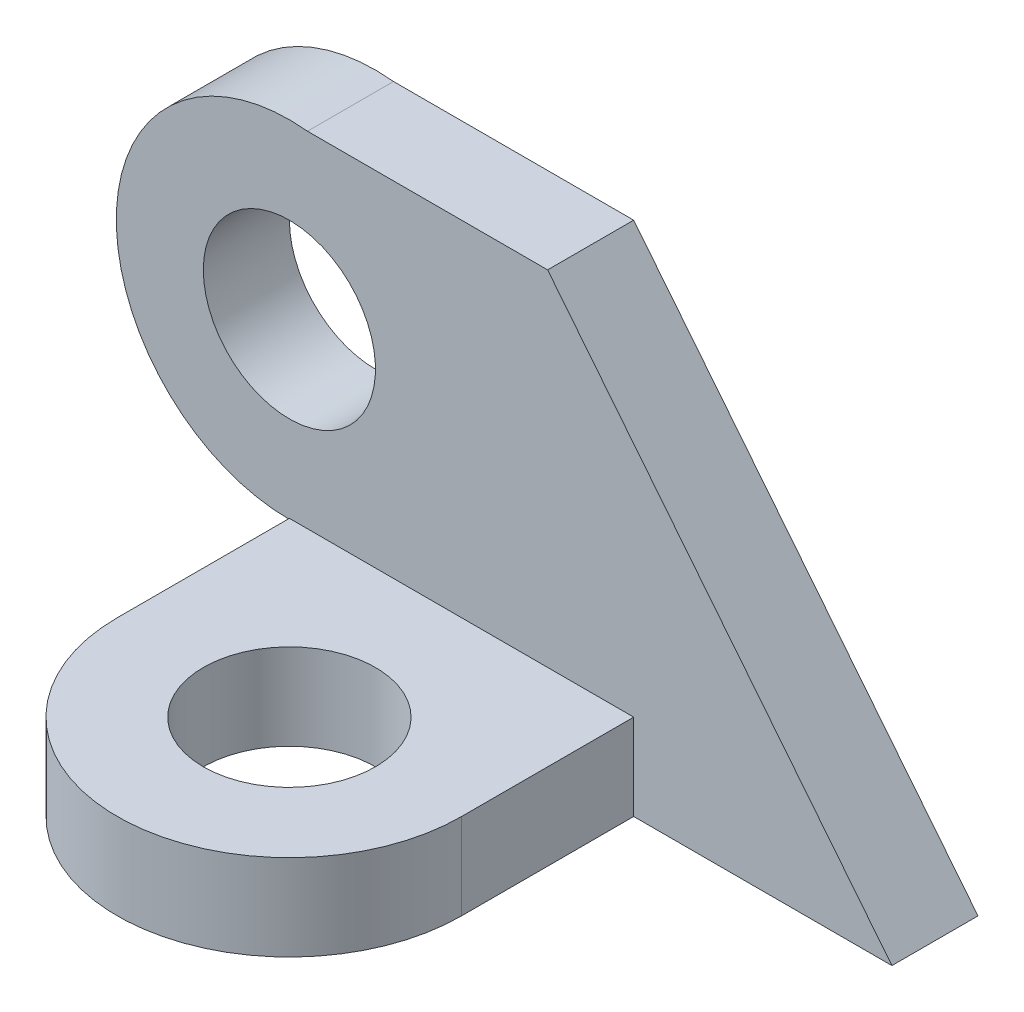
ISO-10303-21;
HEADER;
FILE_DESCRIPTION(('STEP AP214'),'2;1');
FILE_NAME('part.step','',(''),(''),'','','');
FILE_SCHEMA(('AUTOMOTIVE_DESIGN { 1 0 10303 214 1 1 1 1 }'));
ENDSEC;
DATA;
#1=APPLICATION_CONTEXT('core data for automotive mechanical design processes');
#2=APPLICATION_PROTOCOL_DEFINITION('international standard','automotive_design',2000,#1);
#3=PRODUCT_CONTEXT('',#1,'mechanical');
#4=PRODUCT('Part','Part','',(#3));
#5=PRODUCT_RELATED_PRODUCT_CATEGORY('part','',(#4));
#6=PRODUCT_DEFINITION_FORMATION('','',#4);
#7=PRODUCT_DEFINITION_CONTEXT('part definition',#1,'design');
#8=PRODUCT_DEFINITION('design','',#6,#7);
#9=PRODUCT_DEFINITION_SHAPE('','',#8);
#10=(LENGTH_UNIT() NAMED_UNIT(*) SI_UNIT(.MILLI.,.METRE.));
#11=(NAMED_UNIT(*) PLANE_ANGLE_UNIT() SI_UNIT($,.RADIAN.));
#12=(NAMED_UNIT(*) SI_UNIT($,.STERADIAN.) SOLID_ANGLE_UNIT());
#13=UNCERTAINTY_MEASURE_WITH_UNIT(LENGTH_MEASURE(1.E-05),#10,'distance_accuracy_value','');
#14=(GEOMETRIC_REPRESENTATION_CONTEXT(3) GLOBAL_UNCERTAINTY_ASSIGNED_CONTEXT((#13)) GLOBAL_UNIT_ASSIGNED_CONTEXT((#10,
#11,#12)) REPRESENTATION_CONTEXT('',''));
#15=CARTESIAN_POINT('',(0.,0.,0.));
#16=DIRECTION('',(0.,0.,1.));
#17=DIRECTION('',(1.,0.,0.));
#18=AXIS2_PLACEMENT_3D('',#15,#16,#17);
#19=CARTESIAN_POINT('',(-20.,30.,-30.));
#20=DIRECTION('',(0.,0.,1.));
#21=DIRECTION('',(1.,0.,0.));
#22=AXIS2_PLACEMENT_3D('',#19,#20,#21);
#23=CYLINDRICAL_SURFACE('',#22,20.1098289675562);
#24=CARTESIAN_POINT('',(-20.,30.,-20.));
#25=DIRECTION('',(0.,0.,-1.));
#26=DIRECTION('',(-1.,0.,0.));
#27=AXIS2_PLACEMENT_3D('',#24,#25,#26);
#28=CIRCLE('',#27,20.1098289675562);
#29=CARTESIAN_POINT('',(-20.,9.8901710324438,-20.));
#30=VERTEX_POINT('',#29);
#31=CARTESIAN_POINT('',(-17.9011381407148,50.,-20.));
#32=VERTEX_POINT('',#31);
#33=EDGE_CURVE('E149',#30,#32,#28,.T.);
#34=ORIENTED_EDGE('',*,*,#33,.T.);
#35=DIRECTION('',(0.,0.,1.));
#36=VECTOR('',#35,1.);
#37=CARTESIAN_POINT('',(-17.9011381407148,50.,-30.));
#38=LINE('',#37,#36);
#39=CARTESIAN_POINT('',(-17.9011381407148,50.,-30.));
#40=VERTEX_POINT('',#39);
#41=EDGE_CURVE('E12',#40,#32,#38,.T.);
#42=ORIENTED_EDGE('',*,*,#41,.F.);
#43=CARTESIAN_POINT('',(-20.,30.,-30.));
#44=DIRECTION('',(0.,0.,-1.));
#45=DIRECTION('',(-1.,0.,0.));
#46=AXIS2_PLACEMENT_3D('',#43,#44,#45);
#47=CIRCLE('',#46,20.1098289675562);
#48=CARTESIAN_POINT('',(-20.,9.8901710324438,-30.));
#49=VERTEX_POINT('',#48);
#50=EDGE_CURVE('E200',#49,#40,#47,.T.);
#51=ORIENTED_EDGE('',*,*,#50,.F.);
#52=DIRECTION('',(0.,0.,1.));
#53=VECTOR('',#52,1.);
#54=CARTESIAN_POINT('',(-20.,9.8901710324438,-30.));
#55=LINE('',#54,#53);
#56=EDGE_CURVE('E67',#49,#30,#55,.T.);
#57=ORIENTED_EDGE('',*,*,#56,.T.);
#58=EDGE_LOOP('',(#34,#42,#51,#57));
#59=FACE_BOUND('',#58,.T.);
#60=ADVANCED_FACE('F49',(#59),#23,.T.);
#61=CARTESIAN_POINT('',(0.,50.,-30.));
#62=DIRECTION('',(0.,-1.,0.));
#63=DIRECTION('',(1.,0.,0.));
#64=AXIS2_PLACEMENT_3D('',#61,#62,#63);
#65=PLANE('',#64);
#66=DIRECTION('',(1.,0.,0.));
#67=VECTOR('',#66,1.);
#68=CARTESIAN_POINT('',(0.,50.,-20.));
#69=LINE('',#68,#67);
#70=CARTESIAN_POINT('',(10.,50.,-20.));
#71=VERTEX_POINT('',#70);
#72=EDGE_CURVE('E152',#32,#71,#69,.T.);
#73=ORIENTED_EDGE('',*,*,#72,.T.);
#74=DIRECTION('',(0.,0.,1.));
#75=VECTOR('',#74,1.);
#76=CARTESIAN_POINT('',(10.,50.,-30.));
#77=LINE('',#76,#75);
#78=CARTESIAN_POINT('',(10.,50.,-30.));
#79=VERTEX_POINT('',#78);
#80=EDGE_CURVE('E59',#79,#71,#77,.T.);
#81=ORIENTED_EDGE('',*,*,#80,.F.);
#82=DIRECTION('',(1.,0.,0.));
#83=VECTOR('',#82,1.);
#84=CARTESIAN_POINT('',(0.,50.,-30.));
#85=LINE('',#84,#83);
#86=EDGE_CURVE('E102',#40,#79,#85,.T.);
#87=ORIENTED_EDGE('',*,*,#86,.F.);
#88=ORIENTED_EDGE('',*,*,#41,.T.);
#89=EDGE_LOOP('',(#73,#81,#87,#88));
#90=FACE_BOUND('',#89,.T.);
#91=ADVANCED_FACE('F220',(#90),#65,.F.);
#92=CARTESIAN_POINT('',(30.4878048780488,24.390243902439,-30.));
#93=DIRECTION('',(-0.78086880944303,-0.624695047554424,0.));
#94=DIRECTION('',(0.624695047554424,-0.78086880944303,0.));
#95=AXIS2_PLACEMENT_3D('',#92,#93,#94);
#96=PLANE('',#95);
#97=DIRECTION('',(0.624695047554424,-0.78086880944303,0.));
#98=VECTOR('',#97,1.);
#99=CARTESIAN_POINT('',(30.4878048780488,24.390243902439,-20.));
#100=LINE('',#99,#98);
#101=CARTESIAN_POINT('',(50.,0.,-20.));
#102=VERTEX_POINT('',#101);
#103=EDGE_CURVE('E155',#71,#102,#100,.T.);
#104=ORIENTED_EDGE('',*,*,#103,.T.);
#105=DIRECTION('',(0.,0.,1.));
#106=VECTOR('',#105,1.);
#107=CARTESIAN_POINT('',(50.,0.,-30.));
#108=LINE('',#107,#106);
#109=CARTESIAN_POINT('',(50.,0.,-30.));
#110=VERTEX_POINT('',#109);
#111=EDGE_CURVE('E179',#110,#102,#108,.T.);
#112=ORIENTED_EDGE('',*,*,#111,.F.);
#113=DIRECTION('',(0.624695047554424,-0.78086880944303,0.));
#114=VECTOR('',#113,1.);
#115=CARTESIAN_POINT('',(30.4878048780488,24.390243902439,-30.));
#116=LINE('',#115,#114);
#117=EDGE_CURVE('E188',#79,#110,#116,.T.);
#118=ORIENTED_EDGE('',*,*,#117,.F.);
#119=ORIENTED_EDGE('',*,*,#80,.T.);
#120=EDGE_LOOP('',(#104,#112,#118,#119));
#121=FACE_BOUND('',#120,.T.);
#122=ADVANCED_FACE('F186',(#121),#96,.F.);
#123=CARTESIAN_POINT('',(0.,0.,-30.));
#124=DIRECTION('',(0.,-1.,0.));
#125=DIRECTION('',(1.,0.,0.));
#126=AXIS2_PLACEMENT_3D('',#123,#124,#125);
#127=PLANE('',#126);
#128=DIRECTION('',(1.,0.,0.));
#129=VECTOR('',#128,1.);
#130=CARTESIAN_POINT('',(0.,0.,-20.));
#131=LINE('',#130,#129);
#132=CARTESIAN_POINT('',(20.,0.,-20.));
#133=VERTEX_POINT('',#132);
#134=EDGE_CURVE('E159',#133,#102,#131,.T.);
#135=ORIENTED_EDGE('',*,*,#134,.F.);
#136=DIRECTION('',(0.,0.,1.));
#137=VECTOR('',#136,1.);
#138=CARTESIAN_POINT('',(20.,0.,-30.));
#139=LINE('',#138,#137);
#140=CARTESIAN_POINT('',(20.,0.,-30.));
#141=VERTEX_POINT('',#140);
#142=EDGE_CURVE('E125',#141,#133,#139,.T.);
#143=ORIENTED_EDGE('',*,*,#142,.F.);
#144=DIRECTION('',(1.,0.,0.));
#145=VECTOR('',#144,1.);
#146=CARTESIAN_POINT('',(0.,0.,-30.));
#147=LINE('',#146,#145);
#148=EDGE_CURVE('E134',#141,#110,#147,.T.);
#149=ORIENTED_EDGE('',*,*,#148,.T.);
#150=ORIENTED_EDGE('',*,*,#111,.T.);
#151=EDGE_LOOP('',(#135,#143,#149,#150));
#152=FACE_BOUND('',#151,.T.);
#153=ADVANCED_FACE('F193',(#152),#127,.T.);
#154=CARTESIAN_POINT('',(20.,0.,-30.));
#155=DIRECTION('',(-1.,0.,0.));
#156=DIRECTION('',(0.,0.,1.));
#157=AXIS2_PLACEMENT_3D('',#154,#155,#156);
#158=PLANE('',#157);
#159=DIRECTION('',(0.,-1.,0.));
#160=VECTOR('',#159,1.);
#161=CARTESIAN_POINT('',(20.,0.,-20.));
#162=LINE('',#161,#160);
#163=CARTESIAN_POINT('',(20.,10.,-20.));
#164=VERTEX_POINT('',#163);
#165=EDGE_CURVE('E120',#164,#133,#162,.T.);
#166=ORIENTED_EDGE('',*,*,#165,.F.);
#167=DIRECTION('',(0.,0.,1.));
#168=VECTOR('',#167,1.);
#169=CARTESIAN_POINT('',(20.,10.,-30.));
#170=LINE('',#169,#168);
#171=CARTESIAN_POINT('',(20.,10.,-30.));
#172=VERTEX_POINT('',#171);
#173=EDGE_CURVE('E115',#172,#164,#170,.T.);
#174=ORIENTED_EDGE('',*,*,#173,.F.);
#175=DIRECTION('',(0.,-1.,0.));
#176=VECTOR('',#175,1.);
#177=CARTESIAN_POINT('',(20.,0.,-30.));
#178=LINE('',#177,#176);
#179=EDGE_CURVE('E118',#172,#141,#178,.T.);
#180=ORIENTED_EDGE('',*,*,#179,.T.);
#181=ORIENTED_EDGE('',*,*,#142,.T.);
#182=EDGE_LOOP('',(#166,#174,#180,#181));
#183=FACE_BOUND('',#182,.T.);
#184=ADVANCED_FACE('F117',(#183),#158,.T.);
#185=CARTESIAN_POINT('',(0.,10.,-30.));
#186=DIRECTION('',(0.,-1.,0.));
#187=DIRECTION('',(0.,0.,-1.));
#188=AXIS2_PLACEMENT_3D('',#185,#186,#187);
#189=PLANE('',#188);
#190=DIRECTION('',(1.,0.,0.));
#191=VECTOR('',#190,1.);
#192=CARTESIAN_POINT('',(0.,10.,-20.));
#193=LINE('',#192,#191);
#194=CARTESIAN_POINT('',(-20.,10.,-20.));
#195=VERTEX_POINT('',#194);
#196=EDGE_CURVE('E165',#195,#164,#193,.T.);
#197=ORIENTED_EDGE('',*,*,#196,.F.);
#198=DIRECTION('',(0.,0.,1.));
#199=VECTOR('',#198,1.);
#200=CARTESIAN_POINT('',(-20.,10.,-30.));
#201=LINE('',#200,#199);
#202=CARTESIAN_POINT('',(-20.,10.,-30.));
#203=VERTEX_POINT('',#202);
#204=EDGE_CURVE('E90',#203,#195,#201,.T.);
#205=ORIENTED_EDGE('',*,*,#204,.F.);
#206=DIRECTION('',(1.,0.,0.));
#207=VECTOR('',#206,1.);
#208=CARTESIAN_POINT('',(0.,10.,-30.));
#209=LINE('',#208,#207);
#210=EDGE_CURVE('E132',#203,#172,#209,.T.);
#211=ORIENTED_EDGE('',*,*,#210,.T.);
#212=ORIENTED_EDGE('',*,*,#173,.T.);
#213=EDGE_LOOP('',(#197,#205,#211,#212));
#214=FACE_BOUND('',#213,.T.);
#215=ADVANCED_FACE('F137',(#214),#189,.T.);
#216=CARTESIAN_POINT('',(-20.,30.,-30.));
#217=DIRECTION('',(0.,0.,1.));
#218=DIRECTION('',(1.,0.,0.));
#219=AXIS2_PLACEMENT_3D('',#216,#217,#218);
#220=CYLINDRICAL_SURFACE('',#219,10.);
#221=CARTESIAN_POINT('',(-20.,30.,-30.));
#222=DIRECTION('',(0.,0.,-1.));
#223=DIRECTION('',(-1.,0.,0.));
#224=AXIS2_PLACEMENT_3D('',#221,#222,#223);
#225=CIRCLE('',#224,10.);
#226=CARTESIAN_POINT('',(-30.,30.,-30.));
#227=VERTEX_POINT('',#226);
#228=EDGE_CURVE('E172',#227,#227,#225,.T.);
#229=ORIENTED_EDGE('',*,*,#228,.T.);
#230=EDGE_LOOP('',(#229));
#231=FACE_BOUND('',#230,.T.);
#232=CARTESIAN_POINT('',(-20.,30.,-20.));
#233=DIRECTION('',(0.,0.,-1.));
#234=DIRECTION('',(-1.,0.,0.));
#235=AXIS2_PLACEMENT_3D('',#232,#233,#234);
#236=CIRCLE('',#235,10.);
#237=CARTESIAN_POINT('',(-30.,30.,-20.));
#238=VERTEX_POINT('',#237);
#239=EDGE_CURVE('E145',#238,#238,#236,.T.);
#240=ORIENTED_EDGE('',*,*,#239,.F.);
#241=EDGE_LOOP('',(#240));
#242=FACE_BOUND('',#241,.T.);
#243=ADVANCED_FACE('F51',(#231,#242),#220,.F.);
#244=CARTESIAN_POINT('',(-20.,0.,-30.));
#245=DIRECTION('',(1.,0.,0.));
#246=DIRECTION('',(0.,0.,-1.));
#247=AXIS2_PLACEMENT_3D('',#244,#245,#246);
#248=PLANE('',#247);
#249=DIRECTION('',(0.,1.,0.));
#250=VECTOR('',#249,1.);
#251=CARTESIAN_POINT('',(-20.,0.,-20.));
#252=LINE('',#251,#250);
#253=EDGE_CURVE('E168',#30,#195,#252,.T.);
#254=ORIENTED_EDGE('',*,*,#253,.F.);
#255=ORIENTED_EDGE('',*,*,#56,.F.);
#256=DIRECTION('',(0.,1.,0.));
#257=VECTOR('',#256,1.);
#258=CARTESIAN_POINT('',(-20.,0.,-30.));
#259=LINE('',#258,#257);
#260=EDGE_CURVE('E139',#49,#203,#259,.T.);
#261=ORIENTED_EDGE('',*,*,#260,.T.);
#262=ORIENTED_EDGE('',*,*,#204,.T.);
#263=EDGE_LOOP('',(#254,#255,#261,#262));
#264=FACE_BOUND('',#263,.T.);
#265=ADVANCED_FACE('F210',(#264),#248,.T.);
#266=CARTESIAN_POINT('',(0.,0.,-30.));
#267=DIRECTION('',(0.,0.,-1.));
#268=DIRECTION('',(-1.,0.,0.));
#269=AXIS2_PLACEMENT_3D('',#266,#267,#268);
#270=PLANE('',#269);
#271=ORIENTED_EDGE('',*,*,#228,.F.);
#272=EDGE_LOOP('',(#271));
#273=FACE_BOUND('',#272,.T.);
#274=ORIENTED_EDGE('',*,*,#50,.T.);
#275=ORIENTED_EDGE('',*,*,#86,.T.);
#276=ORIENTED_EDGE('',*,*,#117,.T.);
#277=ORIENTED_EDGE('',*,*,#148,.F.);
#278=ORIENTED_EDGE('',*,*,#179,.F.);
#279=ORIENTED_EDGE('',*,*,#210,.F.);
#280=ORIENTED_EDGE('',*,*,#260,.F.);
#281=EDGE_LOOP('',(#274,#275,#276,#277,#278,#279,#280));
#282=FACE_BOUND('',#281,.T.);
#283=ADVANCED_FACE('F130',(#273,#282),#270,.T.);
#284=CARTESIAN_POINT('',(0.,0.,-20.));
#285=DIRECTION('',(0.,0.,-1.));
#286=DIRECTION('',(-1.,0.,0.));
#287=AXIS2_PLACEMENT_3D('',#284,#285,#286);
#288=PLANE('',#287);
#289=ORIENTED_EDGE('',*,*,#239,.T.);
#290=EDGE_LOOP('',(#289));
#291=FACE_BOUND('',#290,.T.);
#292=ORIENTED_EDGE('',*,*,#33,.F.);
#293=ORIENTED_EDGE('',*,*,#253,.T.);
#294=ORIENTED_EDGE('',*,*,#196,.T.);
#295=ORIENTED_EDGE('',*,*,#165,.T.);
#296=ORIENTED_EDGE('',*,*,#134,.T.);
#297=ORIENTED_EDGE('',*,*,#103,.F.);
#298=ORIENTED_EDGE('',*,*,#72,.F.);
#299=EDGE_LOOP('',(#292,#293,#294,#295,#296,#297,#298));
#300=FACE_BOUND('',#299,.T.);
#301=ADVANCED_FACE('F190',(#291,#300),#288,.F.);
#302=CLOSED_SHELL('',(#60,#91,#122,#153,#184,#215,#243,#265,#283,#301));
#303=MANIFOLD_SOLID_BREP('B2',#302);
#304=CARTESIAN_POINT('',(0.,10.,0.));
#305=DIRECTION('',(0.,1.,0.));
#306=DIRECTION('',(0.,0.,1.));
#307=AXIS2_PLACEMENT_3D('',#304,#305,#306);
#308=PLANE('',#307);
#309=CARTESIAN_POINT('',(0.,10.,0.));
#310=DIRECTION('',(0.,1.,0.));
#311=DIRECTION('',(0.,0.,1.));
#312=AXIS2_PLACEMENT_3D('',#309,#310,#311);
#313=CIRCLE('',#312,20.);
#314=CARTESIAN_POINT('',(-20.,10.,0.));
#315=VERTEX_POINT('',#314);
#316=CARTESIAN_POINT('',(20.,10.,0.));
#317=VERTEX_POINT('',#316);
#318=EDGE_CURVE('E356',#315,#317,#313,.T.);
#319=ORIENTED_EDGE('',*,*,#318,.T.);
#320=DIRECTION('',(0.,0.,-1.));
#321=VECTOR('',#320,1.);
#322=CARTESIAN_POINT('',(20.,10.,-20.));
#323=LINE('',#322,#321);
#324=CARTESIAN_POINT('',(20.,10.,-20.));
#325=VERTEX_POINT('',#324);
#326=EDGE_CURVE('E351',#317,#325,#323,.T.);
#327=ORIENTED_EDGE('',*,*,#326,.T.);
#328=DIRECTION('',(-1.,0.,0.));
#329=VECTOR('',#328,1.);
#330=CARTESIAN_POINT('',(-20.,10.,-20.));
#331=LINE('',#330,#329);
#332=CARTESIAN_POINT('',(-20.,10.,-20.));
#333=VERTEX_POINT('',#332);
#334=EDGE_CURVE('E354',#325,#333,#331,.T.);
#335=ORIENTED_EDGE('',*,*,#334,.T.);
#336=DIRECTION('',(0.,0.,1.));
#337=VECTOR('',#336,1.);
#338=CARTESIAN_POINT('',(-20.,10.,0.));
#339=LINE('',#338,#337);
#340=EDGE_CURVE('E324',#333,#315,#339,.T.);
#341=ORIENTED_EDGE('',*,*,#340,.T.);
#342=EDGE_LOOP('',(#319,#327,#335,#341));
#343=FACE_BOUND('',#342,.T.);
#344=CARTESIAN_POINT('',(0.,10.,0.));
#345=DIRECTION('',(0.,1.,0.));
#346=DIRECTION('',(0.,0.,1.));
#347=AXIS2_PLACEMENT_3D('',#344,#345,#346);
#348=CIRCLE('',#347,10.);
#349=CARTESIAN_POINT('',(0.,10.,10.));
#350=VERTEX_POINT('',#349);
#351=EDGE_CURVE('E373',#350,#350,#348,.T.);
#352=ORIENTED_EDGE('',*,*,#351,.F.);
#353=EDGE_LOOP('',(#352));
#354=FACE_BOUND('',#353,.T.);
#355=ADVANCED_FACE('F307',(#343,#354),#308,.T.);
#356=CARTESIAN_POINT('',(0.,0.,0.));
#357=DIRECTION('',(0.,1.,0.));
#358=DIRECTION('',(0.,0.,1.));
#359=AXIS2_PLACEMENT_3D('',#356,#357,#358);
#360=PLANE('',#359);
#361=CARTESIAN_POINT('',(0.,0.,0.));
#362=DIRECTION('',(0.,1.,0.));
#363=DIRECTION('',(0.,0.,1.));
#364=AXIS2_PLACEMENT_3D('',#361,#362,#363);
#365=CIRCLE('',#364,20.);
#366=CARTESIAN_POINT('',(-20.,0.,0.));
#367=VERTEX_POINT('',#366);
#368=CARTESIAN_POINT('',(20.,0.,0.));
#369=VERTEX_POINT('',#368);
#370=EDGE_CURVE('E370',#367,#369,#365,.T.);
#371=ORIENTED_EDGE('',*,*,#370,.F.);
#372=DIRECTION('',(0.,0.,1.));
#373=VECTOR('',#372,1.);
#374=CARTESIAN_POINT('',(-20.,0.,0.));
#375=LINE('',#374,#373);
#376=CARTESIAN_POINT('',(-20.,0.,-20.));
#377=VERTEX_POINT('',#376);
#378=EDGE_CURVE('E344',#377,#367,#375,.T.);
#379=ORIENTED_EDGE('',*,*,#378,.F.);
#380=DIRECTION('',(-1.,0.,0.));
#381=VECTOR('',#380,1.);
#382=CARTESIAN_POINT('',(-20.,0.,-20.));
#383=LINE('',#382,#381);
#384=CARTESIAN_POINT('',(20.,0.,-20.));
#385=VERTEX_POINT('',#384);
#386=EDGE_CURVE('E375',#385,#377,#383,.T.);
#387=ORIENTED_EDGE('',*,*,#386,.F.);
#388=DIRECTION('',(0.,0.,-1.));
#389=VECTOR('',#388,1.);
#390=CARTESIAN_POINT('',(20.,0.,-20.));
#391=LINE('',#390,#389);
#392=EDGE_CURVE('E361',#369,#385,#391,.T.);
#393=ORIENTED_EDGE('',*,*,#392,.F.);
#394=EDGE_LOOP('',(#371,#379,#387,#393));
#395=FACE_BOUND('',#394,.T.);
#396=CARTESIAN_POINT('',(0.,0.,0.));
#397=DIRECTION('',(0.,1.,0.));
#398=DIRECTION('',(0.,0.,1.));
#399=AXIS2_PLACEMENT_3D('',#396,#397,#398);
#400=CIRCLE('',#399,10.);
#401=CARTESIAN_POINT('',(0.,0.,10.));
#402=VERTEX_POINT('',#401);
#403=EDGE_CURVE('E388',#402,#402,#400,.T.);
#404=ORIENTED_EDGE('',*,*,#403,.T.);
#405=EDGE_LOOP('',(#404));
#406=FACE_BOUND('',#405,.T.);
#407=ADVANCED_FACE('F382',(#395,#406),#360,.F.);
#408=CARTESIAN_POINT('',(0.,10.,0.));
#409=DIRECTION('',(0.,-1.,0.));
#410=DIRECTION('',(0.,0.,-1.));
#411=AXIS2_PLACEMENT_3D('',#408,#409,#410);
#412=CYLINDRICAL_SURFACE('',#411,20.);
#413=ORIENTED_EDGE('',*,*,#370,.T.);
#414=DIRECTION('',(0.,-1.,0.));
#415=VECTOR('',#414,1.);
#416=CARTESIAN_POINT('',(20.,10.,0.));
#417=LINE('',#416,#415);
#418=EDGE_CURVE('E47',#317,#369,#417,.T.);
#419=ORIENTED_EDGE('',*,*,#418,.F.);
#420=ORIENTED_EDGE('',*,*,#318,.F.);
#421=DIRECTION('',(0.,-1.,0.));
#422=VECTOR('',#421,1.);
#423=CARTESIAN_POINT('',(-20.,10.,0.));
#424=LINE('',#423,#422);
#425=EDGE_CURVE('E366',#315,#367,#424,.T.);
#426=ORIENTED_EDGE('',*,*,#425,.T.);
#427=EDGE_LOOP('',(#413,#419,#420,#426));
#428=FACE_BOUND('',#427,.T.);
#429=ADVANCED_FACE('F309',(#428),#412,.T.);
#430=CARTESIAN_POINT('',(20.,10.,-20.));
#431=DIRECTION('',(-1.,0.,0.));
#432=DIRECTION('',(0.,0.,1.));
#433=AXIS2_PLACEMENT_3D('',#430,#431,#432);
#434=PLANE('',#433);
#435=ORIENTED_EDGE('',*,*,#392,.T.);
#436=DIRECTION('',(0.,-1.,0.));
#437=VECTOR('',#436,1.);
#438=CARTESIAN_POINT('',(20.,10.,-20.));
#439=LINE('',#438,#437);
#440=EDGE_CURVE('E316',#325,#385,#439,.T.);
#441=ORIENTED_EDGE('',*,*,#440,.F.);
#442=ORIENTED_EDGE('',*,*,#326,.F.);
#443=ORIENTED_EDGE('',*,*,#418,.T.);
#444=EDGE_LOOP('',(#435,#441,#442,#443));
#445=FACE_BOUND('',#444,.T.);
#446=ADVANCED_FACE('F360',(#445),#434,.F.);
#447=CARTESIAN_POINT('',(-20.,10.,-20.));
#448=DIRECTION('',(0.,0.,1.));
#449=DIRECTION('',(1.,0.,0.));
#450=AXIS2_PLACEMENT_3D('',#447,#448,#449);
#451=PLANE('',#450);
#452=ORIENTED_EDGE('',*,*,#386,.T.);
#453=DIRECTION('',(0.,-1.,0.));
#454=VECTOR('',#453,1.);
#455=CARTESIAN_POINT('',(-20.,10.,-20.));
#456=LINE('',#455,#454);
#457=EDGE_CURVE('E340',#333,#377,#456,.T.);
#458=ORIENTED_EDGE('',*,*,#457,.F.);
#459=ORIENTED_EDGE('',*,*,#334,.F.);
#460=ORIENTED_EDGE('',*,*,#440,.T.);
#461=EDGE_LOOP('',(#452,#458,#459,#460));
#462=FACE_BOUND('',#461,.T.);
#463=ADVANCED_FACE('F364',(#462),#451,.F.);
#464=CARTESIAN_POINT('',(-20.,10.,0.));
#465=DIRECTION('',(1.,0.,0.));
#466=DIRECTION('',(0.,0.,-1.));
#467=AXIS2_PLACEMENT_3D('',#464,#465,#466);
#468=PLANE('',#467);
#469=ORIENTED_EDGE('',*,*,#378,.T.);
#470=ORIENTED_EDGE('',*,*,#425,.F.);
#471=ORIENTED_EDGE('',*,*,#340,.F.);
#472=ORIENTED_EDGE('',*,*,#457,.T.);
#473=EDGE_LOOP('',(#469,#470,#471,#472));
#474=FACE_BOUND('',#473,.T.);
#475=ADVANCED_FACE('F402',(#474),#468,.F.);
#476=CARTESIAN_POINT('',(0.,10.,0.));
#477=DIRECTION('',(0.,-1.,0.));
#478=DIRECTION('',(0.,0.,-1.));
#479=AXIS2_PLACEMENT_3D('',#476,#477,#478);
#480=CYLINDRICAL_SURFACE('',#479,10.);
#481=ORIENTED_EDGE('',*,*,#351,.T.);
#482=EDGE_LOOP('',(#481));
#483=FACE_BOUND('',#482,.T.);
#484=ORIENTED_EDGE('',*,*,#403,.F.);
#485=EDGE_LOOP('',(#484));
#486=FACE_BOUND('',#485,.T.);
#487=ADVANCED_FACE('F395',(#483,#486),#480,.F.);
#488=CLOSED_SHELL('',(#355,#407,#429,#446,#463,#475,#487));
#489=MANIFOLD_SOLID_BREP('B6',#488);
#490=ADVANCED_BREP_SHAPE_REPRESENTATION('',(#18,#303,#489),#14);
#491=SHAPE_DEFINITION_REPRESENTATION(#9,#490);
ENDSEC;
END-ISO-10303-21;
